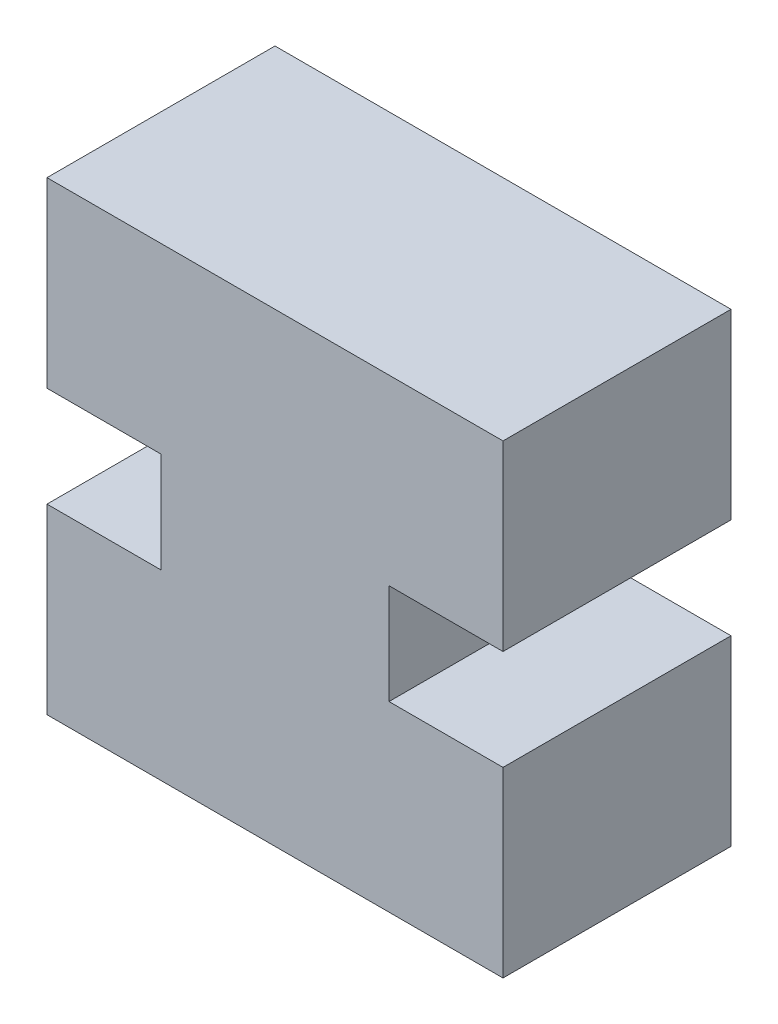
ISO-10303-21;
HEADER;
FILE_DESCRIPTION(('STEP AP214'),'2;1');
FILE_NAME('part.step','',(''),(''),'','','');
FILE_SCHEMA(('AUTOMOTIVE_DESIGN { 1 0 10303 214 1 1 1 1 }'));
ENDSEC;
DATA;
#1=APPLICATION_CONTEXT('core data for automotive mechanical design processes');
#2=APPLICATION_PROTOCOL_DEFINITION('international standard','automotive_design',2000,#1);
#3=PRODUCT_CONTEXT('',#1,'mechanical');
#4=PRODUCT('Part','Part','',(#3));
#5=PRODUCT_RELATED_PRODUCT_CATEGORY('part','',(#4));
#6=PRODUCT_DEFINITION_FORMATION('','',#4);
#7=PRODUCT_DEFINITION_CONTEXT('part definition',#1,'design');
#8=PRODUCT_DEFINITION('design','',#6,#7);
#9=PRODUCT_DEFINITION_SHAPE('','',#8);
#10=(LENGTH_UNIT() NAMED_UNIT(*) SI_UNIT(.MILLI.,.METRE.));
#11=(NAMED_UNIT(*) PLANE_ANGLE_UNIT() SI_UNIT($,.RADIAN.));
#12=(NAMED_UNIT(*) SI_UNIT($,.STERADIAN.) SOLID_ANGLE_UNIT());
#13=UNCERTAINTY_MEASURE_WITH_UNIT(LENGTH_MEASURE(1.E-05),#10,'distance_accuracy_value','');
#14=(GEOMETRIC_REPRESENTATION_CONTEXT(3) GLOBAL_UNCERTAINTY_ASSIGNED_CONTEXT((#13)) GLOBAL_UNIT_ASSIGNED_CONTEXT((#10,
#11,#12)) REPRESENTATION_CONTEXT('',''));
#15=CARTESIAN_POINT('',(0.,0.,0.));
#16=DIRECTION('',(0.,0.,1.));
#17=DIRECTION('',(1.,0.,0.));
#18=AXIS2_PLACEMENT_3D('',#15,#16,#17);
#19=CARTESIAN_POINT('',(0.,-5.08,6.35));
#20=DIRECTION('',(1.,0.,0.));
#21=DIRECTION('',(0.,0.,-1.));
#22=AXIS2_PLACEMENT_3D('',#19,#20,#21);
#23=PLANE('',#22);
#24=DIRECTION('',(0.,-1.,0.));
#25=VECTOR('',#24,1.);
#26=CARTESIAN_POINT('',(0.,-5.08,0.));
#27=LINE('',#26,#25);
#28=CARTESIAN_POINT('',(0.,0.,0.));
#29=VERTEX_POINT('',#28);
#30=CARTESIAN_POINT('',(0.,-5.08,0.));
#31=VERTEX_POINT('',#30);
#32=EDGE_CURVE('E153',#29,#31,#27,.T.);
#33=ORIENTED_EDGE('',*,*,#32,.T.);
#34=DIRECTION('',(0.,0.,-1.));
#35=VECTOR('',#34,1.);
#36=CARTESIAN_POINT('',(0.,-5.08,6.35));
#37=LINE('',#36,#35);
#38=CARTESIAN_POINT('',(0.,-5.08,6.35));
#39=VERTEX_POINT('',#38);
#40=EDGE_CURVE('E11',#39,#31,#37,.T.);
#41=ORIENTED_EDGE('',*,*,#40,.F.);
#42=DIRECTION('',(0.,-1.,0.));
#43=VECTOR('',#42,1.);
#44=CARTESIAN_POINT('',(0.,-5.08,6.35));
#45=LINE('',#44,#43);
#46=CARTESIAN_POINT('',(0.,0.,6.35));
#47=VERTEX_POINT('',#46);
#48=EDGE_CURVE('E175',#47,#39,#45,.T.);
#49=ORIENTED_EDGE('',*,*,#48,.F.);
#50=DIRECTION('',(0.,0.,-1.));
#51=VECTOR('',#50,1.);
#52=CARTESIAN_POINT('',(0.,0.,6.35));
#53=LINE('',#52,#51);
#54=EDGE_CURVE('E149',#47,#29,#53,.T.);
#55=ORIENTED_EDGE('',*,*,#54,.T.);
#56=EDGE_LOOP('',(#33,#41,#49,#55));
#57=FACE_BOUND('',#56,.T.);
#58=ADVANCED_FACE('F33',(#57),#23,.F.);
#59=CARTESIAN_POINT('',(3.175,-5.08,6.35));
#60=DIRECTION('',(0.,1.,0.));
#61=DIRECTION('',(-1.,0.,0.));
#62=AXIS2_PLACEMENT_3D('',#59,#60,#61);
#63=PLANE('',#62);
#64=DIRECTION('',(1.,0.,0.));
#65=VECTOR('',#64,1.);
#66=CARTESIAN_POINT('',(3.175,-5.08,0.));
#67=LINE('',#66,#65);
#68=CARTESIAN_POINT('',(3.175,-5.08,0.));
#69=VERTEX_POINT('',#68);
#70=EDGE_CURVE('E156',#31,#69,#67,.T.);
#71=ORIENTED_EDGE('',*,*,#70,.T.);
#72=DIRECTION('',(0.,0.,-1.));
#73=VECTOR('',#72,1.);
#74=CARTESIAN_POINT('',(3.175,-5.08,6.35));
#75=LINE('',#74,#73);
#76=CARTESIAN_POINT('',(3.175,-5.08,6.35));
#77=VERTEX_POINT('',#76);
#78=EDGE_CURVE('E41',#77,#69,#75,.T.);
#79=ORIENTED_EDGE('',*,*,#78,.F.);
#80=DIRECTION('',(1.,0.,0.));
#81=VECTOR('',#80,1.);
#82=CARTESIAN_POINT('',(3.175,-5.08,6.35));
#83=LINE('',#82,#81);
#84=EDGE_CURVE('E104',#39,#77,#83,.T.);
#85=ORIENTED_EDGE('',*,*,#84,.F.);
#86=ORIENTED_EDGE('',*,*,#40,.T.);
#87=EDGE_LOOP('',(#71,#79,#85,#86));
#88=FACE_BOUND('',#87,.T.);
#89=ADVANCED_FACE('F253',(#88),#63,.F.);
#90=CARTESIAN_POINT('',(3.175,-7.874,6.35));
#91=DIRECTION('',(1.,0.,0.));
#92=DIRECTION('',(0.,0.,-1.));
#93=AXIS2_PLACEMENT_3D('',#90,#91,#92);
#94=PLANE('',#93);
#95=DIRECTION('',(0.,-1.,0.));
#96=VECTOR('',#95,1.);
#97=CARTESIAN_POINT('',(3.175,-7.874,0.));
#98=LINE('',#97,#96);
#99=CARTESIAN_POINT('',(3.175,-7.874,0.));
#100=VERTEX_POINT('',#99);
#101=EDGE_CURVE('E158',#69,#100,#98,.T.);
#102=ORIENTED_EDGE('',*,*,#101,.T.);
#103=DIRECTION('',(0.,0.,-1.));
#104=VECTOR('',#103,1.);
#105=CARTESIAN_POINT('',(3.175,-7.874,6.35));
#106=LINE('',#105,#104);
#107=CARTESIAN_POINT('',(3.175,-7.874,6.35));
#108=VERTEX_POINT('',#107);
#109=EDGE_CURVE('E194',#108,#100,#106,.T.);
#110=ORIENTED_EDGE('',*,*,#109,.F.);
#111=DIRECTION('',(0.,-1.,0.));
#112=VECTOR('',#111,1.);
#113=CARTESIAN_POINT('',(3.175,-7.874,6.35));
#114=LINE('',#113,#112);
#115=EDGE_CURVE('E202',#77,#108,#114,.T.);
#116=ORIENTED_EDGE('',*,*,#115,.F.);
#117=ORIENTED_EDGE('',*,*,#78,.T.);
#118=EDGE_LOOP('',(#102,#110,#116,#117));
#119=FACE_BOUND('',#118,.T.);
#120=ADVANCED_FACE('F200',(#119),#94,.F.);
#121=CARTESIAN_POINT('',(0.,-7.874,6.35));
#122=DIRECTION('',(0.,-1.,0.));
#123=DIRECTION('',(0.,0.,-1.));
#124=AXIS2_PLACEMENT_3D('',#121,#122,#123);
#125=PLANE('',#124);
#126=DIRECTION('',(-1.,0.,0.));
#127=VECTOR('',#126,1.);
#128=CARTESIAN_POINT('',(0.,-7.874,0.));
#129=LINE('',#128,#127);
#130=CARTESIAN_POINT('',(0.,-7.874,0.));
#131=VERTEX_POINT('',#130);
#132=EDGE_CURVE('E160',#100,#131,#129,.T.);
#133=ORIENTED_EDGE('',*,*,#132,.T.);
#134=DIRECTION('',(0.,0.,-1.));
#135=VECTOR('',#134,1.);
#136=CARTESIAN_POINT('',(0.,-7.874,6.35));
#137=LINE('',#136,#135);
#138=CARTESIAN_POINT('',(0.,-7.874,6.35));
#139=VERTEX_POINT('',#138);
#140=EDGE_CURVE('E191',#139,#131,#137,.T.);
#141=ORIENTED_EDGE('',*,*,#140,.F.);
#142=DIRECTION('',(-1.,0.,0.));
#143=VECTOR('',#142,1.);
#144=CARTESIAN_POINT('',(0.,-7.874,6.35));
#145=LINE('',#144,#143);
#146=EDGE_CURVE('E220',#108,#139,#145,.T.);
#147=ORIENTED_EDGE('',*,*,#146,.F.);
#148=ORIENTED_EDGE('',*,*,#109,.T.);
#149=EDGE_LOOP('',(#133,#141,#147,#148));
#150=FACE_BOUND('',#149,.T.);
#151=ADVANCED_FACE('F211',(#150),#125,.F.);
#152=CARTESIAN_POINT('',(0.,-12.954,6.35));
#153=DIRECTION('',(1.,0.,0.));
#154=DIRECTION('',(0.,1.,0.));
#155=AXIS2_PLACEMENT_3D('',#152,#153,#154);
#156=PLANE('',#155);
#157=DIRECTION('',(0.,-1.,0.));
#158=VECTOR('',#157,1.);
#159=CARTESIAN_POINT('',(0.,-12.954,0.));
#160=LINE('',#159,#158);
#161=CARTESIAN_POINT('',(0.,-12.954,0.));
#162=VERTEX_POINT('',#161);
#163=EDGE_CURVE('E162',#131,#162,#160,.T.);
#164=ORIENTED_EDGE('',*,*,#163,.T.);
#165=DIRECTION('',(0.,0.,-1.));
#166=VECTOR('',#165,1.);
#167=CARTESIAN_POINT('',(0.,-12.954,6.35));
#168=LINE('',#167,#166);
#169=CARTESIAN_POINT('',(0.,-12.954,6.35));
#170=VERTEX_POINT('',#169);
#171=EDGE_CURVE('E188',#170,#162,#168,.T.);
#172=ORIENTED_EDGE('',*,*,#171,.F.);
#173=DIRECTION('',(0.,-1.,0.));
#174=VECTOR('',#173,1.);
#175=CARTESIAN_POINT('',(0.,-12.954,6.35));
#176=LINE('',#175,#174);
#177=EDGE_CURVE('E217',#139,#170,#176,.T.);
#178=ORIENTED_EDGE('',*,*,#177,.F.);
#179=ORIENTED_EDGE('',*,*,#140,.T.);
#180=EDGE_LOOP('',(#164,#172,#178,#179));
#181=FACE_BOUND('',#180,.T.);
#182=ADVANCED_FACE('F215',(#181),#156,.F.);
#183=CARTESIAN_POINT('',(12.7,-12.954,6.35));
#184=DIRECTION('',(0.,1.,0.));
#185=DIRECTION('',(0.,0.,1.));
#186=AXIS2_PLACEMENT_3D('',#183,#184,#185);
#187=PLANE('',#186);
#188=DIRECTION('',(1.,0.,0.));
#189=VECTOR('',#188,1.);
#190=CARTESIAN_POINT('',(12.7,-12.954,0.));
#191=LINE('',#190,#189);
#192=CARTESIAN_POINT('',(12.7,-12.954,0.));
#193=VERTEX_POINT('',#192);
#194=EDGE_CURVE('E164',#162,#193,#191,.T.);
#195=ORIENTED_EDGE('',*,*,#194,.T.);
#196=DIRECTION('',(0.,0.,-1.));
#197=VECTOR('',#196,1.);
#198=CARTESIAN_POINT('',(12.7,-12.954,6.35));
#199=LINE('',#198,#197);
#200=CARTESIAN_POINT('',(12.7,-12.954,6.35));
#201=VERTEX_POINT('',#200);
#202=EDGE_CURVE('E185',#201,#193,#199,.T.);
#203=ORIENTED_EDGE('',*,*,#202,.F.);
#204=DIRECTION('',(1.,0.,0.));
#205=VECTOR('',#204,1.);
#206=CARTESIAN_POINT('',(12.7,-12.954,6.35));
#207=LINE('',#206,#205);
#208=EDGE_CURVE('E219',#170,#201,#207,.T.);
#209=ORIENTED_EDGE('',*,*,#208,.F.);
#210=ORIENTED_EDGE('',*,*,#171,.T.);
#211=EDGE_LOOP('',(#195,#203,#209,#210));
#212=FACE_BOUND('',#211,.T.);
#213=ADVANCED_FACE('F266',(#212),#187,.F.);
#214=CARTESIAN_POINT('',(12.7,-7.874,6.35));
#215=DIRECTION('',(-1.,0.,0.));
#216=DIRECTION('',(0.,-1.,0.));
#217=AXIS2_PLACEMENT_3D('',#214,#215,#216);
#218=PLANE('',#217);
#219=DIRECTION('',(0.,1.,0.));
#220=VECTOR('',#219,1.);
#221=CARTESIAN_POINT('',(12.7,-7.874,0.));
#222=LINE('',#221,#220);
#223=CARTESIAN_POINT('',(12.7,-7.874,0.));
#224=VERTEX_POINT('',#223);
#225=EDGE_CURVE('E166',#193,#224,#222,.T.);
#226=ORIENTED_EDGE('',*,*,#225,.T.);
#227=DIRECTION('',(0.,0.,-1.));
#228=VECTOR('',#227,1.);
#229=CARTESIAN_POINT('',(12.7,-7.874,6.35));
#230=LINE('',#229,#228);
#231=CARTESIAN_POINT('',(12.7,-7.874,6.35));
#232=VERTEX_POINT('',#231);
#233=EDGE_CURVE('E182',#232,#224,#230,.T.);
#234=ORIENTED_EDGE('',*,*,#233,.F.);
#235=DIRECTION('',(0.,1.,0.));
#236=VECTOR('',#235,1.);
#237=CARTESIAN_POINT('',(12.7,-7.874,6.35));
#238=LINE('',#237,#236);
#239=EDGE_CURVE('E222',#201,#232,#238,.T.);
#240=ORIENTED_EDGE('',*,*,#239,.F.);
#241=ORIENTED_EDGE('',*,*,#202,.T.);
#242=EDGE_LOOP('',(#226,#234,#240,#241));
#243=FACE_BOUND('',#242,.T.);
#244=ADVANCED_FACE('F269',(#243),#218,.F.);
#245=CARTESIAN_POINT('',(9.525,-7.874,6.35));
#246=DIRECTION('',(0.,-1.,0.));
#247=DIRECTION('',(0.,0.,-1.));
#248=AXIS2_PLACEMENT_3D('',#245,#246,#247);
#249=PLANE('',#248);
#250=DIRECTION('',(-1.,0.,0.));
#251=VECTOR('',#250,1.);
#252=CARTESIAN_POINT('',(9.525,-7.874,0.));
#253=LINE('',#252,#251);
#254=CARTESIAN_POINT('',(9.525,-7.874,0.));
#255=VERTEX_POINT('',#254);
#256=EDGE_CURVE('E168',#224,#255,#253,.T.);
#257=ORIENTED_EDGE('',*,*,#256,.T.);
#258=DIRECTION('',(0.,0.,-1.));
#259=VECTOR('',#258,1.);
#260=CARTESIAN_POINT('',(9.525,-7.874,6.35));
#261=LINE('',#260,#259);
#262=CARTESIAN_POINT('',(9.525,-7.874,6.35));
#263=VERTEX_POINT('',#262);
#264=EDGE_CURVE('E179',#263,#255,#261,.T.);
#265=ORIENTED_EDGE('',*,*,#264,.F.);
#266=DIRECTION('',(-1.,0.,0.));
#267=VECTOR('',#266,1.);
#268=CARTESIAN_POINT('',(9.525,-7.874,6.35));
#269=LINE('',#268,#267);
#270=EDGE_CURVE('E228',#232,#263,#269,.T.);
#271=ORIENTED_EDGE('',*,*,#270,.F.);
#272=ORIENTED_EDGE('',*,*,#233,.T.);
#273=EDGE_LOOP('',(#257,#265,#271,#272));
#274=FACE_BOUND('',#273,.T.);
#275=ADVANCED_FACE('F234',(#274),#249,.F.);
#276=CARTESIAN_POINT('',(9.525,-5.08,6.35));
#277=DIRECTION('',(-1.,0.,0.));
#278=DIRECTION('',(0.,0.,1.));
#279=AXIS2_PLACEMENT_3D('',#276,#277,#278);
#280=PLANE('',#279);
#281=DIRECTION('',(0.,1.,0.));
#282=VECTOR('',#281,1.);
#283=CARTESIAN_POINT('',(9.525,-5.08,0.));
#284=LINE('',#283,#282);
#285=CARTESIAN_POINT('',(9.525,-5.08,0.));
#286=VERTEX_POINT('',#285);
#287=EDGE_CURVE('E170',#255,#286,#284,.T.);
#288=ORIENTED_EDGE('',*,*,#287,.T.);
#289=DIRECTION('',(0.,0.,-1.));
#290=VECTOR('',#289,1.);
#291=CARTESIAN_POINT('',(9.525,-5.08,6.35));
#292=LINE('',#291,#290);
#293=CARTESIAN_POINT('',(9.525,-5.08,6.35));
#294=VERTEX_POINT('',#293);
#295=EDGE_CURVE('E144',#294,#286,#292,.T.);
#296=ORIENTED_EDGE('',*,*,#295,.F.);
#297=DIRECTION('',(0.,1.,0.));
#298=VECTOR('',#297,1.);
#299=CARTESIAN_POINT('',(9.525,-5.08,6.35));
#300=LINE('',#299,#298);
#301=EDGE_CURVE('E135',#263,#294,#300,.T.);
#302=ORIENTED_EDGE('',*,*,#301,.F.);
#303=ORIENTED_EDGE('',*,*,#264,.T.);
#304=EDGE_LOOP('',(#288,#296,#302,#303));
#305=FACE_BOUND('',#304,.T.);
#306=ADVANCED_FACE('F238',(#305),#280,.F.);
#307=CARTESIAN_POINT('',(12.7,-5.08,6.35));
#308=DIRECTION('',(0.,1.,0.));
#309=DIRECTION('',(0.,0.,1.));
#310=AXIS2_PLACEMENT_3D('',#307,#308,#309);
#311=PLANE('',#310);
#312=DIRECTION('',(1.,0.,0.));
#313=VECTOR('',#312,1.);
#314=CARTESIAN_POINT('',(12.7,-5.08,0.));
#315=LINE('',#314,#313);
#316=CARTESIAN_POINT('',(12.7,-5.08,0.));
#317=VERTEX_POINT('',#316);
#318=EDGE_CURVE('E143',#286,#317,#315,.T.);
#319=ORIENTED_EDGE('',*,*,#318,.T.);
#320=DIRECTION('',(0.,0.,-1.));
#321=VECTOR('',#320,1.);
#322=CARTESIAN_POINT('',(12.7,-5.08,6.35));
#323=LINE('',#322,#321);
#324=CARTESIAN_POINT('',(12.7,-5.08,6.35));
#325=VERTEX_POINT('',#324);
#326=EDGE_CURVE('E140',#325,#317,#323,.T.);
#327=ORIENTED_EDGE('',*,*,#326,.F.);
#328=DIRECTION('',(1.,0.,0.));
#329=VECTOR('',#328,1.);
#330=CARTESIAN_POINT('',(12.7,-5.08,6.35));
#331=LINE('',#330,#329);
#332=EDGE_CURVE('E129',#294,#325,#331,.T.);
#333=ORIENTED_EDGE('',*,*,#332,.F.);
#334=ORIENTED_EDGE('',*,*,#295,.T.);
#335=EDGE_LOOP('',(#319,#327,#333,#334));
#336=FACE_BOUND('',#335,.T.);
#337=ADVANCED_FACE('F141',(#336),#311,.F.);
#338=CARTESIAN_POINT('',(12.7,0.,6.35));
#339=DIRECTION('',(-1.,0.,0.));
#340=DIRECTION('',(0.,0.,1.));
#341=AXIS2_PLACEMENT_3D('',#338,#339,#340);
#342=PLANE('',#341);
#343=DIRECTION('',(0.,1.,0.));
#344=VECTOR('',#343,1.);
#345=CARTESIAN_POINT('',(12.7,0.,0.));
#346=LINE('',#345,#344);
#347=CARTESIAN_POINT('',(12.7,0.,0.));
#348=VERTEX_POINT('',#347);
#349=EDGE_CURVE('E90',#317,#348,#346,.T.);
#350=ORIENTED_EDGE('',*,*,#349,.T.);
#351=DIRECTION('',(0.,0.,-1.));
#352=VECTOR('',#351,1.);
#353=CARTESIAN_POINT('',(12.7,0.,6.35));
#354=LINE('',#353,#352);
#355=CARTESIAN_POINT('',(12.7,0.,6.35));
#356=VERTEX_POINT('',#355);
#357=EDGE_CURVE('E145',#356,#348,#354,.T.);
#358=ORIENTED_EDGE('',*,*,#357,.F.);
#359=DIRECTION('',(0.,1.,0.));
#360=VECTOR('',#359,1.);
#361=CARTESIAN_POINT('',(12.7,0.,6.35));
#362=LINE('',#361,#360);
#363=EDGE_CURVE('E133',#325,#356,#362,.T.);
#364=ORIENTED_EDGE('',*,*,#363,.F.);
#365=ORIENTED_EDGE('',*,*,#326,.T.);
#366=EDGE_LOOP('',(#350,#358,#364,#365));
#367=FACE_BOUND('',#366,.T.);
#368=ADVANCED_FACE('F147',(#367),#342,.F.);
#369=CARTESIAN_POINT('',(0.,0.,6.35));
#370=DIRECTION('',(0.,-1.,0.));
#371=DIRECTION('',(0.,0.,-1.));
#372=AXIS2_PLACEMENT_3D('',#369,#370,#371);
#373=PLANE('',#372);
#374=DIRECTION('',(-1.,0.,0.));
#375=VECTOR('',#374,1.);
#376=CARTESIAN_POINT('',(0.,0.,0.));
#377=LINE('',#376,#375);
#378=EDGE_CURVE('E96',#348,#29,#377,.T.);
#379=ORIENTED_EDGE('',*,*,#378,.T.);
#380=ORIENTED_EDGE('',*,*,#54,.F.);
#381=DIRECTION('',(-1.,0.,0.));
#382=VECTOR('',#381,1.);
#383=CARTESIAN_POINT('',(0.,0.,6.35));
#384=LINE('',#383,#382);
#385=EDGE_CURVE('E49',#356,#47,#384,.T.);
#386=ORIENTED_EDGE('',*,*,#385,.F.);
#387=ORIENTED_EDGE('',*,*,#357,.T.);
#388=EDGE_LOOP('',(#379,#380,#386,#387));
#389=FACE_BOUND('',#388,.T.);
#390=ADVANCED_FACE('F242',(#389),#373,.F.);
#391=CARTESIAN_POINT('',(0.,0.,6.35));
#392=DIRECTION('',(0.,0.,-1.));
#393=DIRECTION('',(-1.,0.,0.));
#394=AXIS2_PLACEMENT_3D('',#391,#392,#393);
#395=PLANE('',#394);
#396=ORIENTED_EDGE('',*,*,#48,.T.);
#397=ORIENTED_EDGE('',*,*,#84,.T.);
#398=ORIENTED_EDGE('',*,*,#115,.T.);
#399=ORIENTED_EDGE('',*,*,#146,.T.);
#400=ORIENTED_EDGE('',*,*,#177,.T.);
#401=ORIENTED_EDGE('',*,*,#208,.T.);
#402=ORIENTED_EDGE('',*,*,#239,.T.);
#403=ORIENTED_EDGE('',*,*,#270,.T.);
#404=ORIENTED_EDGE('',*,*,#301,.T.);
#405=ORIENTED_EDGE('',*,*,#332,.T.);
#406=ORIENTED_EDGE('',*,*,#363,.T.);
#407=ORIENTED_EDGE('',*,*,#385,.T.);
#408=EDGE_LOOP('',(#396,#397,#398,#399,#400,#401,#402,#403,#404,#405,#406,#407));
#409=FACE_BOUND('',#408,.T.);
#410=ADVANCED_FACE('F131',(#409),#395,.F.);
#411=CARTESIAN_POINT('',(0.,0.,0.));
#412=DIRECTION('',(0.,0.,-1.));
#413=DIRECTION('',(-1.,0.,0.));
#414=AXIS2_PLACEMENT_3D('',#411,#412,#413);
#415=PLANE('',#414);
#416=ORIENTED_EDGE('',*,*,#32,.F.);
#417=ORIENTED_EDGE('',*,*,#378,.F.);
#418=ORIENTED_EDGE('',*,*,#349,.F.);
#419=ORIENTED_EDGE('',*,*,#318,.F.);
#420=ORIENTED_EDGE('',*,*,#287,.F.);
#421=ORIENTED_EDGE('',*,*,#256,.F.);
#422=ORIENTED_EDGE('',*,*,#225,.F.);
#423=ORIENTED_EDGE('',*,*,#194,.F.);
#424=ORIENTED_EDGE('',*,*,#163,.F.);
#425=ORIENTED_EDGE('',*,*,#132,.F.);
#426=ORIENTED_EDGE('',*,*,#101,.F.);
#427=ORIENTED_EDGE('',*,*,#70,.F.);
#428=EDGE_LOOP('',(#416,#417,#418,#419,#420,#421,#422,#423,#424,#425,#426,#427));
#429=FACE_BOUND('',#428,.T.);
#430=ADVANCED_FACE('F206',(#429),#415,.T.);
#431=CLOSED_SHELL('',(#58,#89,#120,#151,#182,#213,#244,#275,#306,#337,#368,#390,#410,#430));
#432=MANIFOLD_SOLID_BREP('B2',#431);
#433=ADVANCED_BREP_SHAPE_REPRESENTATION('',(#18,#432),#14);
#434=SHAPE_DEFINITION_REPRESENTATION(#9,#433);
ENDSEC;
END-ISO-10303-21;
